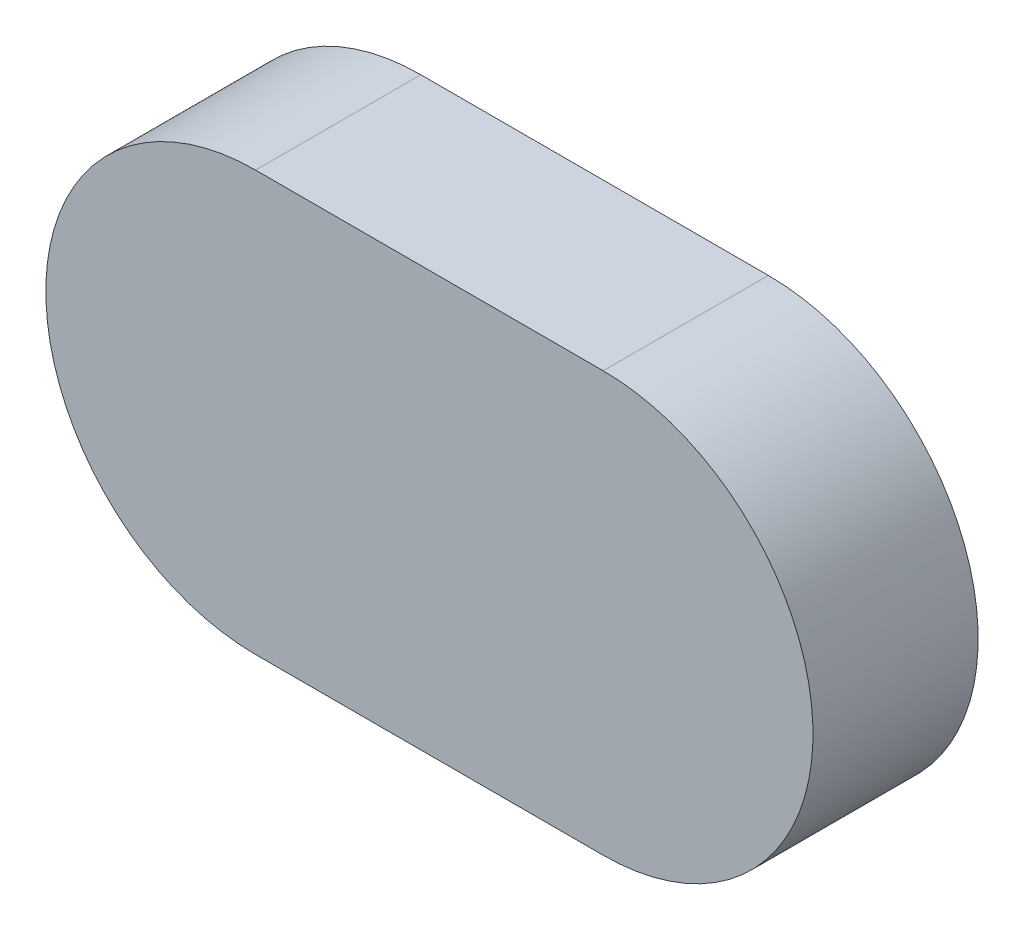
ISO-10303-21;
HEADER;
FILE_DESCRIPTION(('STEP AP214'),'2;1');
FILE_NAME('part.step','',(''),(''),'','','');
FILE_SCHEMA(('AUTOMOTIVE_DESIGN { 1 0 10303 214 1 1 1 1 }'));
ENDSEC;
DATA;
#1=APPLICATION_CONTEXT('core data for automotive mechanical design processes');
#2=APPLICATION_PROTOCOL_DEFINITION('international standard','automotive_design',2000,#1);
#3=PRODUCT_CONTEXT('',#1,'mechanical');
#4=PRODUCT('Part','Part','',(#3));
#5=PRODUCT_RELATED_PRODUCT_CATEGORY('part','',(#4));
#6=PRODUCT_DEFINITION_FORMATION('','',#4);
#7=PRODUCT_DEFINITION_CONTEXT('part definition',#1,'design');
#8=PRODUCT_DEFINITION('design','',#6,#7);
#9=PRODUCT_DEFINITION_SHAPE('','',#8);
#10=(LENGTH_UNIT() NAMED_UNIT(*) SI_UNIT(.MILLI.,.METRE.));
#11=(NAMED_UNIT(*) PLANE_ANGLE_UNIT() SI_UNIT($,.RADIAN.));
#12=(NAMED_UNIT(*) SI_UNIT($,.STERADIAN.) SOLID_ANGLE_UNIT());
#13=UNCERTAINTY_MEASURE_WITH_UNIT(LENGTH_MEASURE(1.E-05),#10,'distance_accuracy_value','');
#14=(GEOMETRIC_REPRESENTATION_CONTEXT(3) GLOBAL_UNCERTAINTY_ASSIGNED_CONTEXT((#13)) GLOBAL_UNIT_ASSIGNED_CONTEXT((#10,
#11,#12)) REPRESENTATION_CONTEXT('',''));
#15=CARTESIAN_POINT('',(0.,0.,0.));
#16=DIRECTION('',(0.,0.,1.));
#17=DIRECTION('',(1.,0.,0.));
#18=AXIS2_PLACEMENT_3D('',#15,#16,#17);
#19=CARTESIAN_POINT('',(94.09255756,53.77180254,0.));
#20=DIRECTION('',(0.,1.,0.));
#21=DIRECTION('',(1.,0.,0.));
#22=AXIS2_PLACEMENT_3D('',#19,#20,#21);
#23=PLANE('',#22);
#24=DIRECTION('',(1.,0.,0.));
#25=VECTOR('',#24,1.);
#26=CARTESIAN_POINT('',(94.09255756,53.77180254,0.1999996));
#27=LINE('',#26,#25);
#28=CARTESIAN_POINT('',(94.09255756,53.77180254,0.1999996));
#29=VERTEX_POINT('',#28);
#30=CARTESIAN_POINT('',(94.5134,53.77180254,0.1999996));
#31=VERTEX_POINT('',#30);
#32=EDGE_CURVE('E11',#29,#31,#27,.T.);
#33=ORIENTED_EDGE('',*,*,#32,.F.);
#34=DIRECTION('',(0.,0.,1.));
#35=VECTOR('',#34,1.);
#36=CARTESIAN_POINT('',(94.09255756,53.77180254,0.));
#37=LINE('',#36,#35);
#38=CARTESIAN_POINT('',(94.09255756,53.77180254,0.));
#39=VERTEX_POINT('',#38);
#40=EDGE_CURVE('E24',#39,#29,#37,.T.);
#41=ORIENTED_EDGE('',*,*,#40,.F.);
#42=DIRECTION('',(1.,0.,0.));
#43=VECTOR('',#42,1.);
#44=CARTESIAN_POINT('',(94.09255756,53.77180254,0.));
#45=LINE('',#44,#43);
#46=CARTESIAN_POINT('',(94.5134,53.77180254,0.));
#47=VERTEX_POINT('',#46);
#48=EDGE_CURVE('E75',#39,#47,#45,.T.);
#49=ORIENTED_EDGE('',*,*,#48,.T.);
#50=DIRECTION('',(0.,0.,1.));
#51=VECTOR('',#50,1.);
#52=CARTESIAN_POINT('',(94.5134,53.77180254,0.));
#53=LINE('',#52,#51);
#54=EDGE_CURVE('E37',#47,#31,#53,.T.);
#55=ORIENTED_EDGE('',*,*,#54,.T.);
#56=EDGE_LOOP('',(#33,#41,#49,#55));
#57=FACE_BOUND('',#56,.T.);
#58=ADVANCED_FACE('F17',(#57),#23,.F.);
#59=CARTESIAN_POINT('',(94.5134,54.02580254,0.));
#60=DIRECTION('',(0.,0.,-1.));
#61=DIRECTION('',(0.,-1.,0.));
#62=AXIS2_PLACEMENT_3D('',#59,#60,#61);
#63=CYLINDRICAL_SURFACE('',#62,0.254);
#64=CARTESIAN_POINT('',(94.5134,54.02580254,0.1999996));
#65=DIRECTION('',(0.,0.,1.));
#66=DIRECTION('',(0.,-1.,0.));
#67=AXIS2_PLACEMENT_3D('',#64,#65,#66);
#68=CIRCLE('',#67,0.254);
#69=CARTESIAN_POINT('',(94.5134,54.27980254,0.1999996));
#70=VERTEX_POINT('',#69);
#71=EDGE_CURVE('E83',#31,#70,#68,.T.);
#72=ORIENTED_EDGE('',*,*,#71,.F.);
#73=ORIENTED_EDGE('',*,*,#54,.F.);
#74=CARTESIAN_POINT('',(94.5134,54.02580254,0.));
#75=DIRECTION('',(0.,0.,1.));
#76=DIRECTION('',(0.,-1.,0.));
#77=AXIS2_PLACEMENT_3D('',#74,#75,#76);
#78=CIRCLE('',#77,0.254);
#79=CARTESIAN_POINT('',(94.5134,54.27980254,0.));
#80=VERTEX_POINT('',#79);
#81=EDGE_CURVE('E81',#47,#80,#78,.T.);
#82=ORIENTED_EDGE('',*,*,#81,.T.);
#83=DIRECTION('',(0.,0.,1.));
#84=VECTOR('',#83,1.);
#85=CARTESIAN_POINT('',(94.5134,54.27980254,0.));
#86=LINE('',#85,#84);
#87=EDGE_CURVE('E67',#80,#70,#86,.T.);
#88=ORIENTED_EDGE('',*,*,#87,.T.);
#89=EDGE_LOOP('',(#72,#73,#82,#88));
#90=FACE_BOUND('',#89,.T.);
#91=ADVANCED_FACE('F89',(#90),#63,.T.);
#92=CARTESIAN_POINT('',(94.5134,54.27980254,0.));
#93=DIRECTION('',(0.,-1.,0.));
#94=DIRECTION('',(-1.,0.,0.));
#95=AXIS2_PLACEMENT_3D('',#92,#93,#94);
#96=PLANE('',#95);
#97=DIRECTION('',(-1.,0.,0.));
#98=VECTOR('',#97,1.);
#99=CARTESIAN_POINT('',(94.5134,54.27980254,0.1999996));
#100=LINE('',#99,#98);
#101=CARTESIAN_POINT('',(94.09255756,54.27980254,0.1999996));
#102=VERTEX_POINT('',#101);
#103=EDGE_CURVE('E71',#70,#102,#100,.T.);
#104=ORIENTED_EDGE('',*,*,#103,.F.);
#105=ORIENTED_EDGE('',*,*,#87,.F.);
#106=DIRECTION('',(-1.,0.,0.));
#107=VECTOR('',#106,1.);
#108=CARTESIAN_POINT('',(94.5134,54.27980254,0.));
#109=LINE('',#108,#107);
#110=CARTESIAN_POINT('',(94.09255756,54.27980254,0.));
#111=VERTEX_POINT('',#110);
#112=EDGE_CURVE('E63',#80,#111,#109,.T.);
#113=ORIENTED_EDGE('',*,*,#112,.T.);
#114=DIRECTION('',(0.,0.,1.));
#115=VECTOR('',#114,1.);
#116=CARTESIAN_POINT('',(94.09255756,54.27980254,0.));
#117=LINE('',#116,#115);
#118=EDGE_CURVE('E53',#111,#102,#117,.T.);
#119=ORIENTED_EDGE('',*,*,#118,.T.);
#120=EDGE_LOOP('',(#104,#105,#113,#119));
#121=FACE_BOUND('',#120,.T.);
#122=ADVANCED_FACE('F66',(#121),#96,.F.);
#123=CARTESIAN_POINT('',(94.09255756,54.02580254,0.));
#124=DIRECTION('',(0.,0.,-1.));
#125=DIRECTION('',(0.,1.,0.));
#126=AXIS2_PLACEMENT_3D('',#123,#124,#125);
#127=CYLINDRICAL_SURFACE('',#126,0.254);
#128=CARTESIAN_POINT('',(94.09255756,54.02580254,0.1999996));
#129=DIRECTION('',(0.,0.,1.));
#130=DIRECTION('',(0.,1.,0.));
#131=AXIS2_PLACEMENT_3D('',#128,#129,#130);
#132=CIRCLE('',#131,0.254);
#133=EDGE_CURVE('E59',#102,#29,#132,.T.);
#134=ORIENTED_EDGE('',*,*,#133,.F.);
#135=ORIENTED_EDGE('',*,*,#118,.F.);
#136=CARTESIAN_POINT('',(94.09255756,54.02580254,0.));
#137=DIRECTION('',(0.,0.,1.));
#138=DIRECTION('',(0.,1.,0.));
#139=AXIS2_PLACEMENT_3D('',#136,#137,#138);
#140=CIRCLE('',#139,0.254);
#141=EDGE_CURVE('E57',#111,#39,#140,.T.);
#142=ORIENTED_EDGE('',*,*,#141,.T.);
#143=ORIENTED_EDGE('',*,*,#40,.T.);
#144=EDGE_LOOP('',(#134,#135,#142,#143));
#145=FACE_BOUND('',#144,.T.);
#146=ADVANCED_FACE('F55',(#145),#127,.T.);
#147=CARTESIAN_POINT('',(94.09255756,53.77180254,0.));
#148=DIRECTION('',(0.,0.,-1.));
#149=DIRECTION('',(-1.,0.,0.));
#150=AXIS2_PLACEMENT_3D('',#147,#148,#149);
#151=PLANE('',#150);
#152=ORIENTED_EDGE('',*,*,#141,.F.);
#153=ORIENTED_EDGE('',*,*,#112,.F.);
#154=ORIENTED_EDGE('',*,*,#81,.F.);
#155=ORIENTED_EDGE('',*,*,#48,.F.);
#156=EDGE_LOOP('',(#152,#153,#154,#155));
#157=FACE_BOUND('',#156,.T.);
#158=ADVANCED_FACE('F74',(#157),#151,.T.);
#159=CARTESIAN_POINT('',(94.09255756,53.77180254,0.1999996));
#160=DIRECTION('',(0.,0.,-1.));
#161=DIRECTION('',(-1.,0.,0.));
#162=AXIS2_PLACEMENT_3D('',#159,#160,#161);
#163=PLANE('',#162);
#164=ORIENTED_EDGE('',*,*,#32,.T.);
#165=ORIENTED_EDGE('',*,*,#71,.T.);
#166=ORIENTED_EDGE('',*,*,#103,.T.);
#167=ORIENTED_EDGE('',*,*,#133,.T.);
#168=EDGE_LOOP('',(#164,#165,#166,#167));
#169=FACE_BOUND('',#168,.T.);
#170=ADVANCED_FACE('F91',(#169),#163,.F.);
#171=CLOSED_SHELL('',(#58,#91,#122,#146,#158,#170));
#172=MANIFOLD_SOLID_BREP('B1',#171);
#173=ADVANCED_BREP_SHAPE_REPRESENTATION('',(#18,#172),#14);
#174=SHAPE_DEFINITION_REPRESENTATION(#9,#173);
ENDSEC;
END-ISO-10303-21;
